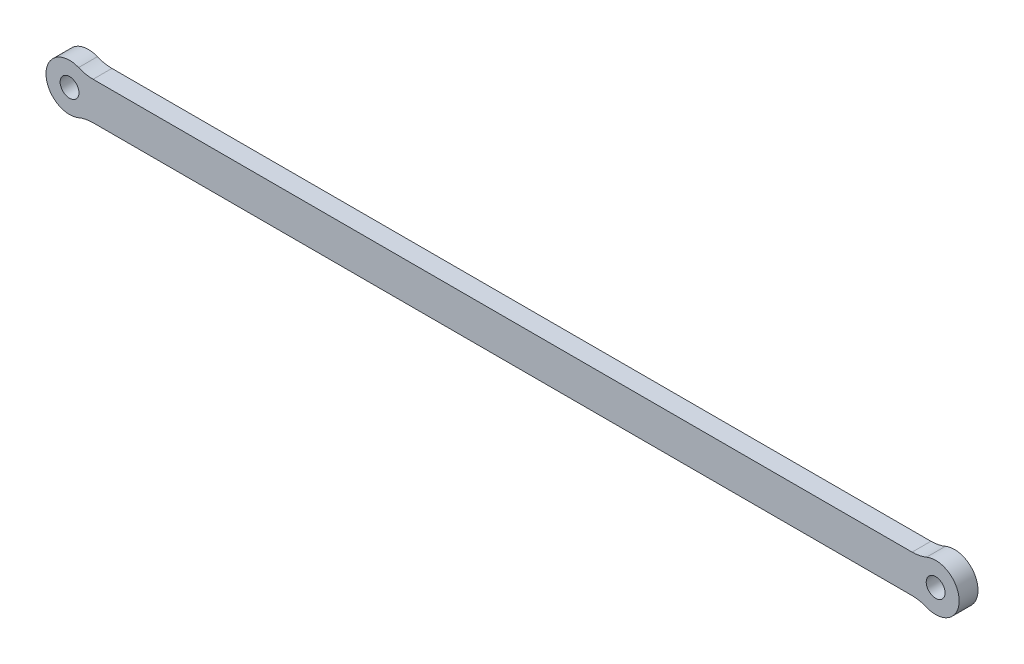
ISO-10303-21;
HEADER;
FILE_DESCRIPTION(('STEP AP214'),'2;1');
FILE_NAME('part.step','',(''),(''),'','','');
FILE_SCHEMA(('AUTOMOTIVE_DESIGN { 1 0 10303 214 1 1 1 1 }'));
ENDSEC;
DATA;
#1=APPLICATION_CONTEXT('core data for automotive mechanical design processes');
#2=APPLICATION_PROTOCOL_DEFINITION('international standard','automotive_design',2000,#1);
#3=PRODUCT_CONTEXT('',#1,'mechanical');
#4=PRODUCT('Part','Part','',(#3));
#5=PRODUCT_RELATED_PRODUCT_CATEGORY('part','',(#4));
#6=PRODUCT_DEFINITION_FORMATION('','',#4);
#7=PRODUCT_DEFINITION_CONTEXT('part definition',#1,'design');
#8=PRODUCT_DEFINITION('design','',#6,#7);
#9=PRODUCT_DEFINITION_SHAPE('','',#8);
#10=(LENGTH_UNIT() NAMED_UNIT(*) SI_UNIT(.MILLI.,.METRE.));
#11=(NAMED_UNIT(*) PLANE_ANGLE_UNIT() SI_UNIT($,.RADIAN.));
#12=(NAMED_UNIT(*) SI_UNIT($,.STERADIAN.) SOLID_ANGLE_UNIT());
#13=UNCERTAINTY_MEASURE_WITH_UNIT(LENGTH_MEASURE(1.E-05),#10,'distance_accuracy_value','');
#14=(GEOMETRIC_REPRESENTATION_CONTEXT(3) GLOBAL_UNCERTAINTY_ASSIGNED_CONTEXT((#13)) GLOBAL_UNIT_ASSIGNED_CONTEXT((#10,
#11,#12)) REPRESENTATION_CONTEXT('',''));
#15=CARTESIAN_POINT('',(0.,0.,0.));
#16=DIRECTION('',(0.,0.,1.));
#17=DIRECTION('',(1.,0.,0.));
#18=AXIS2_PLACEMENT_3D('',#15,#16,#17);
#19=CARTESIAN_POINT('',(115.,0.,5.));
#20=DIRECTION('',(0.,0.,-1.));
#21=DIRECTION('',(-1.,0.,0.));
#22=AXIS2_PLACEMENT_3D('',#19,#20,#21);
#23=CYLINDRICAL_SURFACE('',#22,6.25);
#24=CARTESIAN_POINT('',(115.,0.,0.));
#25=DIRECTION('',(0.,0.,1.));
#26=DIRECTION('',(1.,0.,0.));
#27=AXIS2_PLACEMENT_3D('',#24,#25,#26);
#28=CIRCLE('',#27,6.25);
#29=CARTESIAN_POINT('',(112.596153846154,5.76923076923077,0.));
#30=VERTEX_POINT('',#29);
#31=CARTESIAN_POINT('',(112.596153846154,-5.76923076923077,0.));
#32=VERTEX_POINT('',#31);
#33=EDGE_CURVE('E174',#30,#32,#28,.F.);
#34=ORIENTED_EDGE('',*,*,#33,.F.);
#35=DIRECTION('',(0.,0.,-1.));
#36=VECTOR('',#35,1.);
#37=CARTESIAN_POINT('',(112.596153846154,5.76923076923077,5.));
#38=LINE('',#37,#36);
#39=CARTESIAN_POINT('',(112.596153846154,5.76923076923077,5.));
#40=VERTEX_POINT('',#39);
#41=EDGE_CURVE('E11',#40,#30,#38,.T.);
#42=ORIENTED_EDGE('',*,*,#41,.F.);
#43=CARTESIAN_POINT('',(115.,0.,5.));
#44=DIRECTION('',(0.,0.,1.));
#45=DIRECTION('',(1.,0.,0.));
#46=AXIS2_PLACEMENT_3D('',#43,#44,#45);
#47=CIRCLE('',#46,6.25);
#48=CARTESIAN_POINT('',(112.596153846154,-5.76923076923077,5.));
#49=VERTEX_POINT('',#48);
#50=EDGE_CURVE('E239',#40,#49,#47,.F.);
#51=ORIENTED_EDGE('',*,*,#50,.T.);
#52=DIRECTION('',(0.,0.,-1.));
#53=VECTOR('',#52,1.);
#54=CARTESIAN_POINT('',(112.596153846154,-5.76923076923077,5.));
#55=LINE('',#54,#53);
#56=EDGE_CURVE('E107',#49,#32,#55,.T.);
#57=ORIENTED_EDGE('',*,*,#56,.T.);
#58=EDGE_LOOP('',(#34,#42,#51,#57));
#59=FACE_BOUND('',#58,.T.);
#60=ADVANCED_FACE('F44',(#59),#23,.T.);
#61=CARTESIAN_POINT('',(108.75,15.,5.));
#62=DIRECTION('',(0.,0.,-1.));
#63=DIRECTION('',(-1.,0.,0.));
#64=AXIS2_PLACEMENT_3D('',#61,#62,#63);
#65=CYLINDRICAL_SURFACE('',#64,10.);
#66=CARTESIAN_POINT('',(108.75,15.,0.));
#67=DIRECTION('',(0.,0.,1.));
#68=DIRECTION('',(1.,0.,0.));
#69=AXIS2_PLACEMENT_3D('',#66,#67,#68);
#70=CIRCLE('',#69,10.);
#71=CARTESIAN_POINT('',(108.75,5.,0.));
#72=VERTEX_POINT('',#71);
#73=EDGE_CURVE('E177',#72,#30,#70,.T.);
#74=ORIENTED_EDGE('',*,*,#73,.F.);
#75=DIRECTION('',(0.,0.,-1.));
#76=VECTOR('',#75,1.);
#77=CARTESIAN_POINT('',(108.75,5.,5.));
#78=LINE('',#77,#76);
#79=CARTESIAN_POINT('',(108.75,5.,5.));
#80=VERTEX_POINT('',#79);
#81=EDGE_CURVE('E54',#80,#72,#78,.T.);
#82=ORIENTED_EDGE('',*,*,#81,.F.);
#83=CARTESIAN_POINT('',(108.75,15.,5.));
#84=DIRECTION('',(0.,0.,1.));
#85=DIRECTION('',(1.,0.,0.));
#86=AXIS2_PLACEMENT_3D('',#83,#84,#85);
#87=CIRCLE('',#86,10.);
#88=EDGE_CURVE('E236',#80,#40,#87,.T.);
#89=ORIENTED_EDGE('',*,*,#88,.T.);
#90=ORIENTED_EDGE('',*,*,#41,.T.);
#91=EDGE_LOOP('',(#74,#82,#89,#90));
#92=FACE_BOUND('',#91,.T.);
#93=ADVANCED_FACE('F227',(#92),#65,.F.);
#94=CARTESIAN_POINT('',(0.,5.,5.));
#95=DIRECTION('',(0.,1.,0.));
#96=DIRECTION('',(0.,0.,1.));
#97=AXIS2_PLACEMENT_3D('',#94,#95,#96);
#98=PLANE('',#97);
#99=DIRECTION('',(1.,0.,0.));
#100=VECTOR('',#99,1.);
#101=CARTESIAN_POINT('',(0.,5.,0.));
#102=LINE('',#101,#100);
#103=CARTESIAN_POINT('',(-108.75,5.,0.));
#104=VERTEX_POINT('',#103);
#105=EDGE_CURVE('E181',#104,#72,#102,.T.);
#106=ORIENTED_EDGE('',*,*,#105,.F.);
#107=DIRECTION('',(0.,0.,-1.));
#108=VECTOR('',#107,1.);
#109=CARTESIAN_POINT('',(-108.75,5.,5.));
#110=LINE('',#109,#108);
#111=CARTESIAN_POINT('',(-108.75,5.,5.));
#112=VERTEX_POINT('',#111);
#113=EDGE_CURVE('E213',#112,#104,#110,.T.);
#114=ORIENTED_EDGE('',*,*,#113,.F.);
#115=DIRECTION('',(1.,0.,0.));
#116=VECTOR('',#115,1.);
#117=CARTESIAN_POINT('',(0.,5.,5.));
#118=LINE('',#117,#116);
#119=EDGE_CURVE('E223',#112,#80,#118,.T.);
#120=ORIENTED_EDGE('',*,*,#119,.T.);
#121=ORIENTED_EDGE('',*,*,#81,.T.);
#122=EDGE_LOOP('',(#106,#114,#120,#121));
#123=FACE_BOUND('',#122,.T.);
#124=ADVANCED_FACE('F221',(#123),#98,.T.);
#125=CARTESIAN_POINT('',(-108.75,15.,5.));
#126=DIRECTION('',(0.,0.,-1.));
#127=DIRECTION('',(-1.,0.,0.));
#128=AXIS2_PLACEMENT_3D('',#125,#126,#127);
#129=CYLINDRICAL_SURFACE('',#128,10.);
#130=CARTESIAN_POINT('',(-108.75,15.,0.));
#131=DIRECTION('',(0.,0.,1.));
#132=DIRECTION('',(1.,0.,0.));
#133=AXIS2_PLACEMENT_3D('',#130,#131,#132);
#134=CIRCLE('',#133,10.);
#135=CARTESIAN_POINT('',(-112.596153846154,5.76923076923077,0.));
#136=VERTEX_POINT('',#135);
#137=EDGE_CURVE('E185',#104,#136,#134,.F.);
#138=ORIENTED_EDGE('',*,*,#137,.T.);
#139=DIRECTION('',(0.,0.,-1.));
#140=VECTOR('',#139,1.);
#141=CARTESIAN_POINT('',(-112.596153846154,5.76923076923077,5.));
#142=LINE('',#141,#140);
#143=CARTESIAN_POINT('',(-112.596153846154,5.76923076923077,5.));
#144=VERTEX_POINT('',#143);
#145=EDGE_CURVE('E209',#144,#136,#142,.T.);
#146=ORIENTED_EDGE('',*,*,#145,.F.);
#147=CARTESIAN_POINT('',(-108.75,15.,5.));
#148=DIRECTION('',(0.,0.,1.));
#149=DIRECTION('',(1.,0.,0.));
#150=AXIS2_PLACEMENT_3D('',#147,#148,#149);
#151=CIRCLE('',#150,10.);
#152=EDGE_CURVE('E160',#112,#144,#151,.F.);
#153=ORIENTED_EDGE('',*,*,#152,.F.);
#154=ORIENTED_EDGE('',*,*,#113,.T.);
#155=EDGE_LOOP('',(#138,#146,#153,#154));
#156=FACE_BOUND('',#155,.T.);
#157=ADVANCED_FACE('F233',(#156),#129,.F.);
#158=CARTESIAN_POINT('',(-115.,0.,5.));
#159=DIRECTION('',(0.,0.,-1.));
#160=DIRECTION('',(-1.,0.,0.));
#161=AXIS2_PLACEMENT_3D('',#158,#159,#160);
#162=CYLINDRICAL_SURFACE('',#161,6.25);
#163=CARTESIAN_POINT('',(-115.,0.,0.));
#164=DIRECTION('',(0.,0.,1.));
#165=DIRECTION('',(1.,0.,0.));
#166=AXIS2_PLACEMENT_3D('',#163,#164,#165);
#167=CIRCLE('',#166,6.25);
#168=CARTESIAN_POINT('',(-112.596153846154,-5.76923076923077,0.));
#169=VERTEX_POINT('',#168);
#170=EDGE_CURVE('E189',#136,#169,#167,.T.);
#171=ORIENTED_EDGE('',*,*,#170,.T.);
#172=DIRECTION('',(0.,0.,-1.));
#173=VECTOR('',#172,1.);
#174=CARTESIAN_POINT('',(-112.596153846154,-5.76923076923077,5.));
#175=LINE('',#174,#173);
#176=CARTESIAN_POINT('',(-112.596153846154,-5.76923076923077,5.));
#177=VERTEX_POINT('',#176);
#178=EDGE_CURVE('E142',#177,#169,#175,.T.);
#179=ORIENTED_EDGE('',*,*,#178,.F.);
#180=CARTESIAN_POINT('',(-115.,0.,5.));
#181=DIRECTION('',(0.,0.,1.));
#182=DIRECTION('',(1.,0.,0.));
#183=AXIS2_PLACEMENT_3D('',#180,#181,#182);
#184=CIRCLE('',#183,6.25);
#185=EDGE_CURVE('E153',#144,#177,#184,.T.);
#186=ORIENTED_EDGE('',*,*,#185,.F.);
#187=ORIENTED_EDGE('',*,*,#145,.T.);
#188=EDGE_LOOP('',(#171,#179,#186,#187));
#189=FACE_BOUND('',#188,.T.);
#190=ADVANCED_FACE('F271',(#189),#162,.T.);
#191=CARTESIAN_POINT('',(-108.75,-15.,5.));
#192=DIRECTION('',(0.,0.,-1.));
#193=DIRECTION('',(-1.,0.,0.));
#194=AXIS2_PLACEMENT_3D('',#191,#192,#193);
#195=CYLINDRICAL_SURFACE('',#194,10.);
#196=CARTESIAN_POINT('',(-108.75,-15.,0.));
#197=DIRECTION('',(0.,0.,1.));
#198=DIRECTION('',(1.,0.,0.));
#199=AXIS2_PLACEMENT_3D('',#196,#197,#198);
#200=CIRCLE('',#199,10.);
#201=CARTESIAN_POINT('',(-108.75,-5.,0.));
#202=VERTEX_POINT('',#201);
#203=EDGE_CURVE('E138',#202,#169,#200,.T.);
#204=ORIENTED_EDGE('',*,*,#203,.F.);
#205=DIRECTION('',(0.,0.,-1.));
#206=VECTOR('',#205,1.);
#207=CARTESIAN_POINT('',(-108.75,-5.,5.));
#208=LINE('',#207,#206);
#209=CARTESIAN_POINT('',(-108.75,-5.,5.));
#210=VERTEX_POINT('',#209);
#211=EDGE_CURVE('E132',#210,#202,#208,.T.);
#212=ORIENTED_EDGE('',*,*,#211,.F.);
#213=CARTESIAN_POINT('',(-108.75,-15.,5.));
#214=DIRECTION('',(0.,0.,1.));
#215=DIRECTION('',(1.,0.,0.));
#216=AXIS2_PLACEMENT_3D('',#213,#214,#215);
#217=CIRCLE('',#216,10.);
#218=EDGE_CURVE('E136',#210,#177,#217,.T.);
#219=ORIENTED_EDGE('',*,*,#218,.T.);
#220=ORIENTED_EDGE('',*,*,#178,.T.);
#221=EDGE_LOOP('',(#204,#212,#219,#220));
#222=FACE_BOUND('',#221,.T.);
#223=ADVANCED_FACE('F134',(#222),#195,.F.);
#224=CARTESIAN_POINT('',(0.,-5.,5.));
#225=DIRECTION('',(0.,1.,0.));
#226=DIRECTION('',(0.,0.,1.));
#227=AXIS2_PLACEMENT_3D('',#224,#225,#226);
#228=PLANE('',#227);
#229=DIRECTION('',(1.,0.,0.));
#230=VECTOR('',#229,1.);
#231=CARTESIAN_POINT('',(0.,-5.,0.));
#232=LINE('',#231,#230);
#233=CARTESIAN_POINT('',(108.75,-5.,0.));
#234=VERTEX_POINT('',#233);
#235=EDGE_CURVE('E195',#202,#234,#232,.T.);
#236=ORIENTED_EDGE('',*,*,#235,.T.);
#237=DIRECTION('',(0.,0.,-1.));
#238=VECTOR('',#237,1.);
#239=CARTESIAN_POINT('',(108.75,-5.,5.));
#240=LINE('',#239,#238);
#241=CARTESIAN_POINT('',(108.75,-5.,5.));
#242=VERTEX_POINT('',#241);
#243=EDGE_CURVE('E143',#242,#234,#240,.T.);
#244=ORIENTED_EDGE('',*,*,#243,.F.);
#245=DIRECTION('',(1.,0.,0.));
#246=VECTOR('',#245,1.);
#247=CARTESIAN_POINT('',(0.,-5.,5.));
#248=LINE('',#247,#246);
#249=EDGE_CURVE('E146',#210,#242,#248,.T.);
#250=ORIENTED_EDGE('',*,*,#249,.F.);
#251=ORIENTED_EDGE('',*,*,#211,.T.);
#252=EDGE_LOOP('',(#236,#244,#250,#251));
#253=FACE_BOUND('',#252,.T.);
#254=ADVANCED_FACE('F147',(#253),#228,.F.);
#255=CARTESIAN_POINT('',(108.75,-15.,5.));
#256=DIRECTION('',(0.,0.,-1.));
#257=DIRECTION('',(-1.,0.,0.));
#258=AXIS2_PLACEMENT_3D('',#255,#256,#257);
#259=CYLINDRICAL_SURFACE('',#258,10.);
#260=CARTESIAN_POINT('',(108.75,-15.,0.));
#261=DIRECTION('',(0.,0.,1.));
#262=DIRECTION('',(1.,0.,0.));
#263=AXIS2_PLACEMENT_3D('',#260,#261,#262);
#264=CIRCLE('',#263,10.);
#265=EDGE_CURVE('E100',#234,#32,#264,.F.);
#266=ORIENTED_EDGE('',*,*,#265,.T.);
#267=ORIENTED_EDGE('',*,*,#56,.F.);
#268=CARTESIAN_POINT('',(108.75,-15.,5.));
#269=DIRECTION('',(0.,0.,1.));
#270=DIRECTION('',(1.,0.,0.));
#271=AXIS2_PLACEMENT_3D('',#268,#269,#270);
#272=CIRCLE('',#271,10.);
#273=EDGE_CURVE('E65',#242,#49,#272,.F.);
#274=ORIENTED_EDGE('',*,*,#273,.F.);
#275=ORIENTED_EDGE('',*,*,#243,.T.);
#276=EDGE_LOOP('',(#266,#267,#274,#275));
#277=FACE_BOUND('',#276,.T.);
#278=ADVANCED_FACE('F279',(#277),#259,.F.);
#279=CARTESIAN_POINT('',(-115.,0.,5.));
#280=DIRECTION('',(0.,0.,-1.));
#281=DIRECTION('',(-1.,0.,0.));
#282=AXIS2_PLACEMENT_3D('',#279,#280,#281);
#283=CYLINDRICAL_SURFACE('',#282,2.50000000000001);
#284=CARTESIAN_POINT('',(-115.,0.,5.));
#285=DIRECTION('',(0.,0.,1.));
#286=DIRECTION('',(1.,0.,0.));
#287=AXIS2_PLACEMENT_3D('',#284,#285,#286);
#288=CIRCLE('',#287,2.50000000000001);
#289=CARTESIAN_POINT('',(-112.5,0.,5.));
#290=VERTEX_POINT('',#289);
#291=EDGE_CURVE('E203',#290,#290,#288,.T.);
#292=ORIENTED_EDGE('',*,*,#291,.T.);
#293=EDGE_LOOP('',(#292));
#294=FACE_BOUND('',#293,.T.);
#295=CARTESIAN_POINT('',(-115.,0.,0.));
#296=DIRECTION('',(0.,0.,1.));
#297=DIRECTION('',(1.,0.,0.));
#298=AXIS2_PLACEMENT_3D('',#295,#296,#297);
#299=CIRCLE('',#298,2.50000000000001);
#300=CARTESIAN_POINT('',(-112.5,0.,0.));
#301=VERTEX_POINT('',#300);
#302=EDGE_CURVE('E170',#301,#301,#299,.T.);
#303=ORIENTED_EDGE('',*,*,#302,.F.);
#304=EDGE_LOOP('',(#303));
#305=FACE_BOUND('',#304,.T.);
#306=ADVANCED_FACE('F46',(#294,#305),#283,.F.);
#307=CARTESIAN_POINT('',(115.,0.,5.));
#308=DIRECTION('',(0.,0.,-1.));
#309=DIRECTION('',(-1.,0.,0.));
#310=AXIS2_PLACEMENT_3D('',#307,#308,#309);
#311=CYLINDRICAL_SURFACE('',#310,2.50000000000001);
#312=CARTESIAN_POINT('',(115.,0.,5.));
#313=DIRECTION('',(0.,0.,1.));
#314=DIRECTION('',(1.,0.,0.));
#315=AXIS2_PLACEMENT_3D('',#312,#313,#314);
#316=CIRCLE('',#315,2.50000000000001);
#317=CARTESIAN_POINT('',(117.5,0.,5.));
#318=VERTEX_POINT('',#317);
#319=EDGE_CURVE('E166',#318,#318,#316,.F.);
#320=ORIENTED_EDGE('',*,*,#319,.F.);
#321=EDGE_LOOP('',(#320));
#322=FACE_BOUND('',#321,.T.);
#323=CARTESIAN_POINT('',(115.,0.,0.));
#324=DIRECTION('',(0.,0.,1.));
#325=DIRECTION('',(1.,0.,0.));
#326=AXIS2_PLACEMENT_3D('',#323,#324,#325);
#327=CIRCLE('',#326,2.50000000000001);
#328=CARTESIAN_POINT('',(117.5,0.,0.));
#329=VERTEX_POINT('',#328);
#330=EDGE_CURVE('E199',#329,#329,#327,.F.);
#331=ORIENTED_EDGE('',*,*,#330,.T.);
#332=EDGE_LOOP('',(#331));
#333=FACE_BOUND('',#332,.T.);
#334=ADVANCED_FACE('F251',(#322,#333),#311,.F.);
#335=CARTESIAN_POINT('',(0.,0.,5.));
#336=DIRECTION('',(0.,0.,1.));
#337=DIRECTION('',(1.,0.,0.));
#338=AXIS2_PLACEMENT_3D('',#335,#336,#337);
#339=PLANE('',#338);
#340=ORIENTED_EDGE('',*,*,#291,.F.);
#341=EDGE_LOOP('',(#340));
#342=FACE_BOUND('',#341,.T.);
#343=ORIENTED_EDGE('',*,*,#50,.F.);
#344=ORIENTED_EDGE('',*,*,#88,.F.);
#345=ORIENTED_EDGE('',*,*,#119,.F.);
#346=ORIENTED_EDGE('',*,*,#152,.T.);
#347=ORIENTED_EDGE('',*,*,#185,.T.);
#348=ORIENTED_EDGE('',*,*,#218,.F.);
#349=ORIENTED_EDGE('',*,*,#249,.T.);
#350=ORIENTED_EDGE('',*,*,#273,.T.);
#351=EDGE_LOOP('',(#343,#344,#345,#346,#347,#348,#349,#350));
#352=FACE_BOUND('',#351,.T.);
#353=ORIENTED_EDGE('',*,*,#319,.T.);
#354=EDGE_LOOP('',(#353));
#355=FACE_BOUND('',#354,.T.);
#356=ADVANCED_FACE('F150',(#342,#352,#355),#339,.T.);
#357=CARTESIAN_POINT('',(0.,0.,0.));
#358=DIRECTION('',(0.,0.,1.));
#359=DIRECTION('',(1.,0.,0.));
#360=AXIS2_PLACEMENT_3D('',#357,#358,#359);
#361=PLANE('',#360);
#362=ORIENTED_EDGE('',*,*,#302,.T.);
#363=EDGE_LOOP('',(#362));
#364=FACE_BOUND('',#363,.T.);
#365=ORIENTED_EDGE('',*,*,#33,.T.);
#366=ORIENTED_EDGE('',*,*,#265,.F.);
#367=ORIENTED_EDGE('',*,*,#235,.F.);
#368=ORIENTED_EDGE('',*,*,#203,.T.);
#369=ORIENTED_EDGE('',*,*,#170,.F.);
#370=ORIENTED_EDGE('',*,*,#137,.F.);
#371=ORIENTED_EDGE('',*,*,#105,.T.);
#372=ORIENTED_EDGE('',*,*,#73,.T.);
#373=EDGE_LOOP('',(#365,#366,#367,#368,#369,#370,#371,#372));
#374=FACE_BOUND('',#373,.T.);
#375=ORIENTED_EDGE('',*,*,#330,.F.);
#376=EDGE_LOOP('',(#375));
#377=FACE_BOUND('',#376,.T.);
#378=ADVANCED_FACE('F229',(#364,#374,#377),#361,.F.);
#379=CLOSED_SHELL('',(#60,#93,#124,#157,#190,#223,#254,#278,#306,#334,#356,#378));
#380=MANIFOLD_SOLID_BREP('B2',#379);
#381=ADVANCED_BREP_SHAPE_REPRESENTATION('',(#18,#380),#14);
#382=SHAPE_DEFINITION_REPRESENTATION(#9,#381);
ENDSEC;
END-ISO-10303-21;
